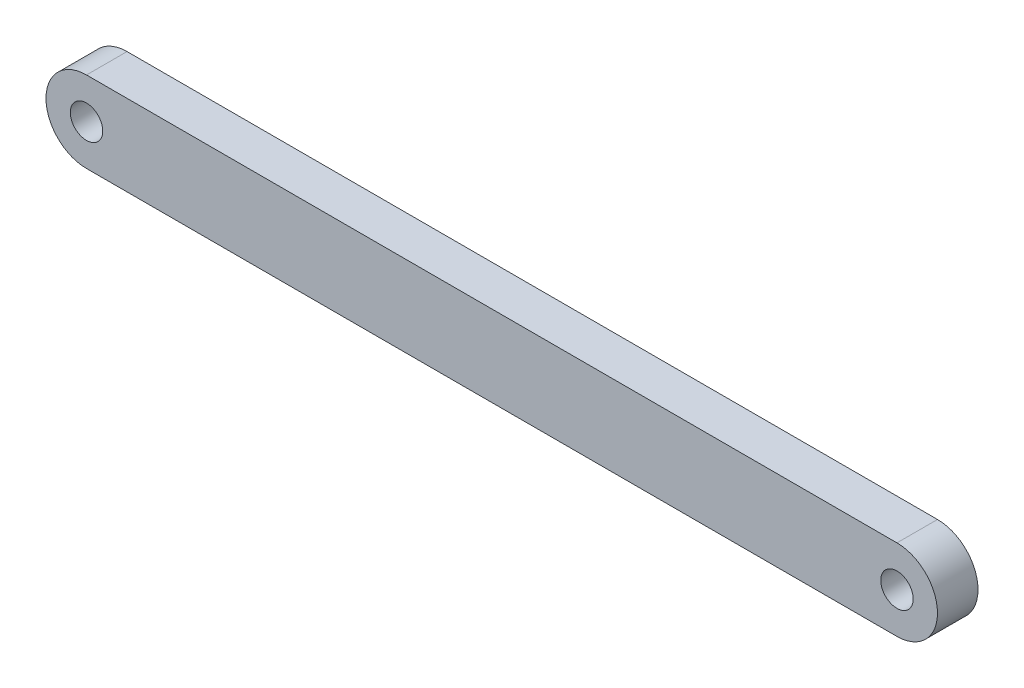
ISO-10303-21;
HEADER;
FILE_DESCRIPTION(('STEP AP214'),'2;1');
FILE_NAME('part.step','',(''),(''),'','','');
FILE_SCHEMA(('AUTOMOTIVE_DESIGN { 1 0 10303 214 1 1 1 1 }'));
ENDSEC;
DATA;
#1=APPLICATION_CONTEXT('core data for automotive mechanical design processes');
#2=APPLICATION_PROTOCOL_DEFINITION('international standard','automotive_design',2000,#1);
#3=PRODUCT_CONTEXT('',#1,'mechanical');
#4=PRODUCT('Part','Part','',(#3));
#5=PRODUCT_RELATED_PRODUCT_CATEGORY('part','',(#4));
#6=PRODUCT_DEFINITION_FORMATION('','',#4);
#7=PRODUCT_DEFINITION_CONTEXT('part definition',#1,'design');
#8=PRODUCT_DEFINITION('design','',#6,#7);
#9=PRODUCT_DEFINITION_SHAPE('','',#8);
#10=(LENGTH_UNIT() NAMED_UNIT(*) SI_UNIT(.MILLI.,.METRE.));
#11=(NAMED_UNIT(*) PLANE_ANGLE_UNIT() SI_UNIT($,.RADIAN.));
#12=(NAMED_UNIT(*) SI_UNIT($,.STERADIAN.) SOLID_ANGLE_UNIT());
#13=UNCERTAINTY_MEASURE_WITH_UNIT(LENGTH_MEASURE(1.E-05),#10,'distance_accuracy_value','');
#14=(GEOMETRIC_REPRESENTATION_CONTEXT(3) GLOBAL_UNCERTAINTY_ASSIGNED_CONTEXT((#13)) GLOBAL_UNIT_ASSIGNED_CONTEXT((#10,
#11,#12)) REPRESENTATION_CONTEXT('',''));
#15=CARTESIAN_POINT('',(0.,0.,0.));
#16=DIRECTION('',(0.,0.,1.));
#17=DIRECTION('',(1.,0.,0.));
#18=AXIS2_PLACEMENT_3D('',#15,#16,#17);
#19=CARTESIAN_POINT('',(-100.,0.,5.));
#20=DIRECTION('',(0.,0.,-1.));
#21=DIRECTION('',(-1.,0.,0.));
#22=AXIS2_PLACEMENT_3D('',#19,#20,#21);
#23=CYLINDRICAL_SURFACE('',#22,10.);
#24=CARTESIAN_POINT('',(-100.,0.,-5.));
#25=DIRECTION('',(0.,0.,1.));
#26=DIRECTION('',(1.,0.,0.));
#27=AXIS2_PLACEMENT_3D('',#24,#25,#26);
#28=CIRCLE('',#27,10.);
#29=CARTESIAN_POINT('',(-100.,10.,-5.));
#30=VERTEX_POINT('',#29);
#31=CARTESIAN_POINT('',(-100.,-10.,-5.));
#32=VERTEX_POINT('',#31);
#33=EDGE_CURVE('E120',#30,#32,#28,.T.);
#34=ORIENTED_EDGE('',*,*,#33,.T.);
#35=DIRECTION('',(0.,0.,-1.));
#36=VECTOR('',#35,1.);
#37=CARTESIAN_POINT('',(-100.,-10.,5.));
#38=LINE('',#37,#36);
#39=CARTESIAN_POINT('',(-100.,-10.,5.));
#40=VERTEX_POINT('',#39);
#41=EDGE_CURVE('E11',#40,#32,#38,.T.);
#42=ORIENTED_EDGE('',*,*,#41,.F.);
#43=CARTESIAN_POINT('',(-100.,0.,5.));
#44=DIRECTION('',(0.,0.,1.));
#45=DIRECTION('',(1.,0.,0.));
#46=AXIS2_PLACEMENT_3D('',#43,#44,#45);
#47=CIRCLE('',#46,10.);
#48=CARTESIAN_POINT('',(-100.,10.,5.));
#49=VERTEX_POINT('',#48);
#50=EDGE_CURVE('E103',#49,#40,#47,.T.);
#51=ORIENTED_EDGE('',*,*,#50,.F.);
#52=DIRECTION('',(0.,0.,-1.));
#53=VECTOR('',#52,1.);
#54=CARTESIAN_POINT('',(-100.,10.,5.));
#55=LINE('',#54,#53);
#56=EDGE_CURVE('E116',#49,#30,#55,.T.);
#57=ORIENTED_EDGE('',*,*,#56,.T.);
#58=EDGE_LOOP('',(#34,#42,#51,#57));
#59=FACE_BOUND('',#58,.T.);
#60=ADVANCED_FACE('F43',(#59),#23,.T.);
#61=CARTESIAN_POINT('',(-100.,-10.,5.));
#62=DIRECTION('',(0.,1.,0.));
#63=DIRECTION('',(-1.,0.,0.));
#64=AXIS2_PLACEMENT_3D('',#61,#62,#63);
#65=PLANE('',#64);
#66=DIRECTION('',(1.,0.,0.));
#67=VECTOR('',#66,1.);
#68=CARTESIAN_POINT('',(-100.,-10.,-5.));
#69=LINE('',#68,#67);
#70=CARTESIAN_POINT('',(100.,-9.99999999999996,-5.));
#71=VERTEX_POINT('',#70);
#72=EDGE_CURVE('E108',#32,#71,#69,.T.);
#73=ORIENTED_EDGE('',*,*,#72,.T.);
#74=DIRECTION('',(0.,0.,-1.));
#75=VECTOR('',#74,1.);
#76=CARTESIAN_POINT('',(100.,-9.99999999999996,5.));
#77=LINE('',#76,#75);
#78=CARTESIAN_POINT('',(100.,-9.99999999999996,5.));
#79=VERTEX_POINT('',#78);
#80=EDGE_CURVE('E52',#79,#71,#77,.T.);
#81=ORIENTED_EDGE('',*,*,#80,.F.);
#82=DIRECTION('',(1.,0.,0.));
#83=VECTOR('',#82,1.);
#84=CARTESIAN_POINT('',(-100.,-10.,5.));
#85=LINE('',#84,#83);
#86=EDGE_CURVE('E98',#40,#79,#85,.T.);
#87=ORIENTED_EDGE('',*,*,#86,.F.);
#88=ORIENTED_EDGE('',*,*,#41,.T.);
#89=EDGE_LOOP('',(#73,#81,#87,#88));
#90=FACE_BOUND('',#89,.T.);
#91=ADVANCED_FACE('F107',(#90),#65,.F.);
#92=CARTESIAN_POINT('',(100.,0.,5.));
#93=DIRECTION('',(0.,0.,-1.));
#94=DIRECTION('',(-1.,0.,0.));
#95=AXIS2_PLACEMENT_3D('',#92,#93,#94);
#96=CYLINDRICAL_SURFACE('',#95,10.);
#97=CARTESIAN_POINT('',(100.,0.,-5.));
#98=DIRECTION('',(0.,0.,1.));
#99=DIRECTION('',(1.,0.,0.));
#100=AXIS2_PLACEMENT_3D('',#97,#98,#99);
#101=CIRCLE('',#100,10.);
#102=CARTESIAN_POINT('',(100.,10.,-5.));
#103=VERTEX_POINT('',#102);
#104=EDGE_CURVE('E84',#71,#103,#101,.T.);
#105=ORIENTED_EDGE('',*,*,#104,.T.);
#106=DIRECTION('',(0.,0.,-1.));
#107=VECTOR('',#106,1.);
#108=CARTESIAN_POINT('',(100.,10.,5.));
#109=LINE('',#108,#107);
#110=CARTESIAN_POINT('',(100.,10.,5.));
#111=VERTEX_POINT('',#110);
#112=EDGE_CURVE('E110',#111,#103,#109,.T.);
#113=ORIENTED_EDGE('',*,*,#112,.F.);
#114=CARTESIAN_POINT('',(100.,0.,5.));
#115=DIRECTION('',(0.,0.,1.));
#116=DIRECTION('',(1.,0.,0.));
#117=AXIS2_PLACEMENT_3D('',#114,#115,#116);
#118=CIRCLE('',#117,10.);
#119=EDGE_CURVE('E101',#79,#111,#118,.T.);
#120=ORIENTED_EDGE('',*,*,#119,.F.);
#121=ORIENTED_EDGE('',*,*,#80,.T.);
#122=EDGE_LOOP('',(#105,#113,#120,#121));
#123=FACE_BOUND('',#122,.T.);
#124=ADVANCED_FACE('F111',(#123),#96,.T.);
#125=CARTESIAN_POINT('',(-100.,10.,5.));
#126=DIRECTION('',(0.,-1.,0.));
#127=DIRECTION('',(1.,0.,0.));
#128=AXIS2_PLACEMENT_3D('',#125,#126,#127);
#129=PLANE('',#128);
#130=DIRECTION('',(-1.,0.,0.));
#131=VECTOR('',#130,1.);
#132=CARTESIAN_POINT('',(-100.,10.,-5.));
#133=LINE('',#132,#131);
#134=EDGE_CURVE('E91',#103,#30,#133,.T.);
#135=ORIENTED_EDGE('',*,*,#134,.T.);
#136=ORIENTED_EDGE('',*,*,#56,.F.);
#137=DIRECTION('',(-1.,0.,0.));
#138=VECTOR('',#137,1.);
#139=CARTESIAN_POINT('',(-100.,10.,5.));
#140=LINE('',#139,#138);
#141=EDGE_CURVE('E62',#111,#49,#140,.T.);
#142=ORIENTED_EDGE('',*,*,#141,.F.);
#143=ORIENTED_EDGE('',*,*,#112,.T.);
#144=EDGE_LOOP('',(#135,#136,#142,#143));
#145=FACE_BOUND('',#144,.T.);
#146=ADVANCED_FACE('F135',(#145),#129,.F.);
#147=CARTESIAN_POINT('',(-100.,0.,5.));
#148=DIRECTION('',(0.,0.,1.));
#149=DIRECTION('',(1.,0.,0.));
#150=AXIS2_PLACEMENT_3D('',#147,#148,#149);
#151=PLANE('',#150);
#152=CARTESIAN_POINT('',(-100.,0.,5.));
#153=DIRECTION('',(0.,0.,1.));
#154=DIRECTION('',(1.,0.,0.));
#155=AXIS2_PLACEMENT_3D('',#152,#153,#154);
#156=CIRCLE('',#155,4.);
#157=CARTESIAN_POINT('',(-96.,0.,5.));
#158=VERTEX_POINT('',#157);
#159=EDGE_CURVE('E151',#158,#158,#156,.T.);
#160=ORIENTED_EDGE('',*,*,#159,.F.);
#161=EDGE_LOOP('',(#160));
#162=FACE_BOUND('',#161,.T.);
#163=CARTESIAN_POINT('',(100.,0.,5.));
#164=DIRECTION('',(0.,0.,1.));
#165=DIRECTION('',(1.,0.,0.));
#166=AXIS2_PLACEMENT_3D('',#163,#164,#165);
#167=CIRCLE('',#166,4.);
#168=CARTESIAN_POINT('',(104.,0.,5.));
#169=VERTEX_POINT('',#168);
#170=EDGE_CURVE('E144',#169,#169,#167,.T.);
#171=ORIENTED_EDGE('',*,*,#170,.F.);
#172=EDGE_LOOP('',(#171));
#173=FACE_BOUND('',#172,.T.);
#174=ORIENTED_EDGE('',*,*,#50,.T.);
#175=ORIENTED_EDGE('',*,*,#86,.T.);
#176=ORIENTED_EDGE('',*,*,#119,.T.);
#177=ORIENTED_EDGE('',*,*,#141,.T.);
#178=EDGE_LOOP('',(#174,#175,#176,#177));
#179=FACE_BOUND('',#178,.T.);
#180=ADVANCED_FACE('F99',(#162,#173,#179),#151,.T.);
#181=CARTESIAN_POINT('',(-100.,0.,-5.));
#182=DIRECTION('',(0.,0.,1.));
#183=DIRECTION('',(1.,0.,0.));
#184=AXIS2_PLACEMENT_3D('',#181,#182,#183);
#185=PLANE('',#184);
#186=CARTESIAN_POINT('',(-100.,0.,-5.));
#187=DIRECTION('',(0.,0.,1.));
#188=DIRECTION('',(1.,0.,0.));
#189=AXIS2_PLACEMENT_3D('',#186,#187,#188);
#190=CIRCLE('',#189,4.);
#191=CARTESIAN_POINT('',(-96.,0.,-5.));
#192=VERTEX_POINT('',#191);
#193=EDGE_CURVE('E147',#192,#192,#190,.T.);
#194=ORIENTED_EDGE('',*,*,#193,.T.);
#195=EDGE_LOOP('',(#194));
#196=FACE_BOUND('',#195,.T.);
#197=CARTESIAN_POINT('',(100.,0.,-5.));
#198=DIRECTION('',(0.,0.,1.));
#199=DIRECTION('',(1.,0.,0.));
#200=AXIS2_PLACEMENT_3D('',#197,#198,#199);
#201=CIRCLE('',#200,4.);
#202=CARTESIAN_POINT('',(104.,0.,-5.));
#203=VERTEX_POINT('',#202);
#204=EDGE_CURVE('E124',#203,#203,#201,.T.);
#205=ORIENTED_EDGE('',*,*,#204,.T.);
#206=EDGE_LOOP('',(#205));
#207=FACE_BOUND('',#206,.T.);
#208=ORIENTED_EDGE('',*,*,#33,.F.);
#209=ORIENTED_EDGE('',*,*,#134,.F.);
#210=ORIENTED_EDGE('',*,*,#104,.F.);
#211=ORIENTED_EDGE('',*,*,#72,.F.);
#212=EDGE_LOOP('',(#208,#209,#210,#211));
#213=FACE_BOUND('',#212,.T.);
#214=ADVANCED_FACE('F138',(#196,#207,#213),#185,.F.);
#215=CARTESIAN_POINT('',(100.,0.,5.));
#216=DIRECTION('',(0.,0.,1.));
#217=DIRECTION('',(1.,0.,0.));
#218=AXIS2_PLACEMENT_3D('',#215,#216,#217);
#219=CYLINDRICAL_SURFACE('',#218,4.);
#220=ORIENTED_EDGE('',*,*,#204,.F.);
#221=EDGE_LOOP('',(#220));
#222=FACE_BOUND('',#221,.T.);
#223=ORIENTED_EDGE('',*,*,#170,.T.);
#224=EDGE_LOOP('',(#223));
#225=FACE_BOUND('',#224,.T.);
#226=ADVANCED_FACE('F163',(#222,#225),#219,.F.);
#227=CARTESIAN_POINT('',(-100.,0.,5.));
#228=DIRECTION('',(0.,0.,1.));
#229=DIRECTION('',(1.,0.,0.));
#230=AXIS2_PLACEMENT_3D('',#227,#228,#229);
#231=CYLINDRICAL_SURFACE('',#230,4.);
#232=ORIENTED_EDGE('',*,*,#193,.F.);
#233=EDGE_LOOP('',(#232));
#234=FACE_BOUND('',#233,.T.);
#235=ORIENTED_EDGE('',*,*,#159,.T.);
#236=EDGE_LOOP('',(#235));
#237=FACE_BOUND('',#236,.T.);
#238=ADVANCED_FACE('F156',(#234,#237),#231,.F.);
#239=CLOSED_SHELL('',(#60,#91,#124,#146,#180,#214,#226,#238));
#240=MANIFOLD_SOLID_BREP('B2',#239);
#241=ADVANCED_BREP_SHAPE_REPRESENTATION('',(#18,#240),#14);
#242=SHAPE_DEFINITION_REPRESENTATION(#9,#241);
ENDSEC;
END-ISO-10303-21;
